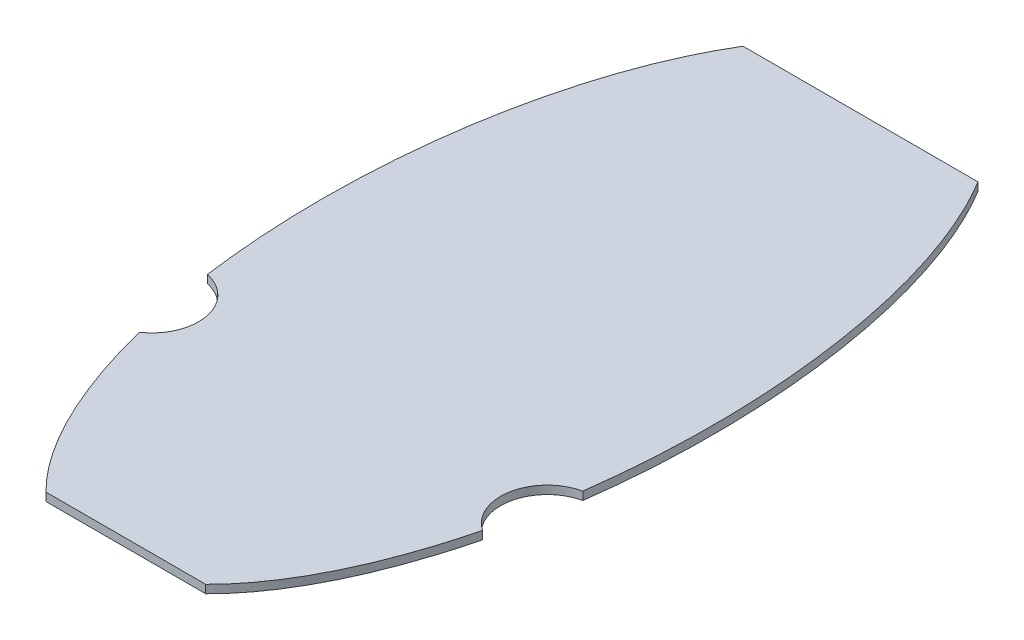
ISO-10303-21;
HEADER;
FILE_DESCRIPTION(('STEP AP214'),'2;1');
FILE_NAME('part.step','',(''),(''),'','','');
FILE_SCHEMA(('AUTOMOTIVE_DESIGN { 1 0 10303 214 1 1 1 1 }'));
ENDSEC;
DATA;
#1=APPLICATION_CONTEXT('core data for automotive mechanical design processes');
#2=APPLICATION_PROTOCOL_DEFINITION('international standard','automotive_design',2000,#1);
#3=PRODUCT_CONTEXT('',#1,'mechanical');
#4=PRODUCT('Part','Part','',(#3));
#5=PRODUCT_RELATED_PRODUCT_CATEGORY('part','',(#4));
#6=PRODUCT_DEFINITION_FORMATION('','',#4);
#7=PRODUCT_DEFINITION_CONTEXT('part definition',#1,'design');
#8=PRODUCT_DEFINITION('design','',#6,#7);
#9=PRODUCT_DEFINITION_SHAPE('','',#8);
#10=(LENGTH_UNIT() NAMED_UNIT(*) SI_UNIT(.MILLI.,.METRE.));
#11=(NAMED_UNIT(*) PLANE_ANGLE_UNIT() SI_UNIT($,.RADIAN.));
#12=(NAMED_UNIT(*) SI_UNIT($,.STERADIAN.) SOLID_ANGLE_UNIT());
#13=UNCERTAINTY_MEASURE_WITH_UNIT(LENGTH_MEASURE(1.E-05),#10,'distance_accuracy_value','');
#14=(GEOMETRIC_REPRESENTATION_CONTEXT(3) GLOBAL_UNCERTAINTY_ASSIGNED_CONTEXT((#13)) GLOBAL_UNIT_ASSIGNED_CONTEXT((#10,
#11,#12)) REPRESENTATION_CONTEXT('',''));
#15=CARTESIAN_POINT('',(0.,0.,0.));
#16=DIRECTION('',(0.,0.,1.));
#17=DIRECTION('',(1.,0.,0.));
#18=AXIS2_PLACEMENT_3D('',#15,#16,#17);
#19=CARTESIAN_POINT('',(0.,0.5588,0.));
#20=DIRECTION('',(0.,1.,0.));
#21=DIRECTION('',(0.,0.,1.));
#22=AXIS2_PLACEMENT_3D('',#19,#20,#21);
#23=PLANE('',#22);
#24=CARTESIAN_POINT('',(0.,0.5588,0.));
#25=DIRECTION('',(0.,1.,0.));
#26=DIRECTION('',(0.,0.,1.));
#27=AXIS2_PLACEMENT_3D('',#24,#25,#26);
#28=ELLIPSE('',#27,29.21,13.335);
#29=CARTESIAN_POINT('',(5.43884297019529,0.5588,26.67));
#30=VERTEX_POINT('',#29);
#31=CARTESIAN_POINT('',(11.687805540383,0.5588,14.0630322860657));
#32=VERTEX_POINT('',#31);
#33=EDGE_CURVE('E139',#30,#32,#28,.T.);
#34=ORIENTED_EDGE('',*,*,#33,.T.);
#35=CARTESIAN_POINT('',(13.462,0.5588,11.43));
#36=DIRECTION('',(0.,1.,0.));
#37=DIRECTION('',(0.,0.,1.));
#38=AXIS2_PLACEMENT_3D('',#35,#36,#37);
#39=CIRCLE('',#38,3.175);
#40=CARTESIAN_POINT('',(12.7814282532744,0.5588,8.32879908784373));
#41=VERTEX_POINT('',#40);
#42=EDGE_CURVE('E98',#41,#32,#39,.T.);
#43=ORIENTED_EDGE('',*,*,#42,.F.);
#44=CARTESIAN_POINT('',(8.00100000000001,0.5588,-23.368));
#45=VERTEX_POINT('',#44);
#46=EDGE_CURVE('E137',#41,#45,#28,.T.);
#47=ORIENTED_EDGE('',*,*,#46,.T.);
#48=DIRECTION('',(-1.,0.,0.));
#49=VECTOR('',#48,1.);
#50=CARTESIAN_POINT('',(-8.00100000000001,0.5588,-23.368));
#51=LINE('',#50,#49);
#52=CARTESIAN_POINT('',(-8.00100000000001,0.5588,-23.368));
#53=VERTEX_POINT('',#52);
#54=EDGE_CURVE('E128',#45,#53,#51,.T.);
#55=ORIENTED_EDGE('',*,*,#54,.T.);
#56=CARTESIAN_POINT('',(0.,0.5588,0.));
#57=DIRECTION('',(0.,1.,0.));
#58=DIRECTION('',(0.,0.,1.));
#59=AXIS2_PLACEMENT_3D('',#56,#57,#58);
#60=ELLIPSE('',#59,29.21,13.335);
#61=CARTESIAN_POINT('',(-12.7814282532744,0.5588,8.32879908784372));
#62=VERTEX_POINT('',#61);
#63=EDGE_CURVE('E146',#53,#62,#60,.T.);
#64=ORIENTED_EDGE('',*,*,#63,.T.);
#65=CARTESIAN_POINT('',(-13.462,0.5588,11.43));
#66=DIRECTION('',(0.,1.,0.));
#67=DIRECTION('',(0.,0.,1.));
#68=AXIS2_PLACEMENT_3D('',#65,#66,#67);
#69=CIRCLE('',#68,3.175);
#70=CARTESIAN_POINT('',(-11.687805540383,0.5588,14.0630322860657));
#71=VERTEX_POINT('',#70);
#72=EDGE_CURVE('E241',#71,#62,#69,.T.);
#73=ORIENTED_EDGE('',*,*,#72,.F.);
#74=CARTESIAN_POINT('',(-5.4388429701953,0.5588,26.67));
#75=VERTEX_POINT('',#74);
#76=EDGE_CURVE('E118',#71,#75,#60,.T.);
#77=ORIENTED_EDGE('',*,*,#76,.T.);
#78=DIRECTION('',(1.,0.,0.));
#79=VECTOR('',#78,1.);
#80=CARTESIAN_POINT('',(-5.4388429701953,0.5588,26.67));
#81=LINE('',#80,#79);
#82=EDGE_CURVE('E144',#75,#30,#81,.T.);
#83=ORIENTED_EDGE('',*,*,#82,.T.);
#84=EDGE_LOOP('',(#34,#43,#47,#55,#64,#73,#77,#83));
#85=FACE_BOUND('',#84,.T.);
#86=ADVANCED_FACE('F33',(#85),#23,.T.);
#87=CARTESIAN_POINT('',(0.,0.,0.));
#88=DIRECTION('',(0.,1.,0.));
#89=DIRECTION('',(0.,0.,1.));
#90=AXIS2_PLACEMENT_3D('',#87,#88,#89);
#91=PLANE('',#90);
#92=CARTESIAN_POINT('',(13.462,0.,11.43));
#93=DIRECTION('',(0.,1.,0.));
#94=DIRECTION('',(0.,0.,1.));
#95=AXIS2_PLACEMENT_3D('',#92,#93,#94);
#96=CIRCLE('',#95,3.175);
#97=CARTESIAN_POINT('',(12.7814282532744,0.,8.32879908784373));
#98=VERTEX_POINT('',#97);
#99=CARTESIAN_POINT('',(11.687805540383,0.,14.0630322860657));
#100=VERTEX_POINT('',#99);
#101=EDGE_CURVE('E48',#98,#100,#96,.T.);
#102=ORIENTED_EDGE('',*,*,#101,.T.);
#103=CARTESIAN_POINT('',(0.,0.,0.));
#104=DIRECTION('',(0.,1.,0.));
#105=DIRECTION('',(0.,0.,1.));
#106=AXIS2_PLACEMENT_3D('',#103,#104,#105);
#107=ELLIPSE('',#106,29.21,13.335);
#108=CARTESIAN_POINT('',(5.43884297019529,0.,26.67));
#109=VERTEX_POINT('',#108);
#110=EDGE_CURVE('E108',#109,#100,#107,.T.);
#111=ORIENTED_EDGE('',*,*,#110,.F.);
#112=DIRECTION('',(1.,0.,0.));
#113=VECTOR('',#112,1.);
#114=CARTESIAN_POINT('',(-5.4388429701953,0.,26.67));
#115=LINE('',#114,#113);
#116=CARTESIAN_POINT('',(-5.4388429701953,0.,26.67));
#117=VERTEX_POINT('',#116);
#118=EDGE_CURVE('E120',#117,#109,#115,.T.);
#119=ORIENTED_EDGE('',*,*,#118,.F.);
#120=CARTESIAN_POINT('',(0.,0.,0.));
#121=DIRECTION('',(0.,1.,0.));
#122=DIRECTION('',(0.,0.,1.));
#123=AXIS2_PLACEMENT_3D('',#120,#121,#122);
#124=ELLIPSE('',#123,29.21,13.335);
#125=CARTESIAN_POINT('',(-11.687805540383,0.,14.0630322860657));
#126=VERTEX_POINT('',#125);
#127=EDGE_CURVE('E233',#126,#117,#124,.T.);
#128=ORIENTED_EDGE('',*,*,#127,.F.);
#129=CARTESIAN_POINT('',(-13.462,0.,11.43));
#130=DIRECTION('',(0.,1.,0.));
#131=DIRECTION('',(0.,0.,1.));
#132=AXIS2_PLACEMENT_3D('',#129,#130,#131);
#133=CIRCLE('',#132,3.175);
#134=CARTESIAN_POINT('',(-12.7814282532744,0.,8.32879908784363));
#135=VERTEX_POINT('',#134);
#136=EDGE_CURVE('E140',#126,#135,#133,.T.);
#137=ORIENTED_EDGE('',*,*,#136,.T.);
#138=CARTESIAN_POINT('',(-8.00100000000001,0.,-23.368));
#139=VERTEX_POINT('',#138);
#140=EDGE_CURVE('E238',#139,#135,#124,.T.);
#141=ORIENTED_EDGE('',*,*,#140,.F.);
#142=DIRECTION('',(-1.,0.,0.));
#143=VECTOR('',#142,1.);
#144=CARTESIAN_POINT('',(-8.00100000000001,0.,-23.368));
#145=LINE('',#144,#143);
#146=CARTESIAN_POINT('',(8.00100000000001,0.,-23.368));
#147=VERTEX_POINT('',#146);
#148=EDGE_CURVE('E116',#147,#139,#145,.T.);
#149=ORIENTED_EDGE('',*,*,#148,.F.);
#150=EDGE_CURVE('E110',#98,#147,#107,.T.);
#151=ORIENTED_EDGE('',*,*,#150,.F.);
#152=EDGE_LOOP('',(#102,#111,#119,#128,#137,#141,#149,#151));
#153=FACE_BOUND('',#152,.T.);
#154=ADVANCED_FACE('F106',(#153),#91,.F.);
#155=DIRECTION('',(0.,-1.,0.));
#156=VECTOR('',#155,1.);
#157=SURFACE_OF_LINEAR_EXTRUSION('',#28,#156);
#158=DIRECTION('',(0.,-1.,0.));
#159=VECTOR('',#158,1.);
#160=CARTESIAN_POINT('',(11.687805540383,0.5588,14.0630322860657));
#161=LINE('',#160,#159);
#162=EDGE_CURVE('E11',#32,#100,#161,.T.);
#163=ORIENTED_EDGE('',*,*,#162,.F.);
#164=ORIENTED_EDGE('',*,*,#33,.F.);
#165=DIRECTION('',(0.,-1.,0.));
#166=VECTOR('',#165,1.);
#167=CARTESIAN_POINT('',(5.43884297019529,0.5588,26.67));
#168=LINE('',#167,#166);
#169=EDGE_CURVE('E115',#30,#109,#168,.T.);
#170=ORIENTED_EDGE('',*,*,#169,.T.);
#171=ORIENTED_EDGE('',*,*,#110,.T.);
#172=EDGE_LOOP('',(#163,#164,#170,#171));
#173=FACE_BOUND('',#172,.T.);
#174=ADVANCED_FACE('F113',(#173),#157,.F.);
#175=DIRECTION('',(0.,-1.,0.));
#176=VECTOR('',#175,1.);
#177=CARTESIAN_POINT('',(12.7814282532744,0.5588,8.32879908784373));
#178=LINE('',#177,#176);
#179=EDGE_CURVE('E42',#98,#41,#178,.F.);
#180=ORIENTED_EDGE('',*,*,#179,.F.);
#181=ORIENTED_EDGE('',*,*,#150,.T.);
#182=DIRECTION('',(0.,-1.,0.));
#183=VECTOR('',#182,1.);
#184=CARTESIAN_POINT('',(8.00100000000001,0.5588,-23.368));
#185=LINE('',#184,#183);
#186=EDGE_CURVE('E127',#45,#147,#185,.T.);
#187=ORIENTED_EDGE('',*,*,#186,.F.);
#188=ORIENTED_EDGE('',*,*,#46,.F.);
#189=EDGE_LOOP('',(#180,#181,#187,#188));
#190=FACE_BOUND('',#189,.T.);
#191=ADVANCED_FACE('F142',(#190),#157,.F.);
#192=DIRECTION('',(0.,-1.,0.));
#193=VECTOR('',#192,1.);
#194=SURFACE_OF_LINEAR_EXTRUSION('',#60,#193);
#195=DIRECTION('',(0.,-1.,0.));
#196=VECTOR('',#195,1.);
#197=CARTESIAN_POINT('',(-11.687805540383,0.5588,14.0630322860658));
#198=LINE('',#197,#196);
#199=EDGE_CURVE('E230',#126,#71,#198,.F.);
#200=ORIENTED_EDGE('',*,*,#199,.F.);
#201=ORIENTED_EDGE('',*,*,#127,.T.);
#202=DIRECTION('',(0.,-1.,0.));
#203=VECTOR('',#202,1.);
#204=CARTESIAN_POINT('',(-5.4388429701953,0.5588,26.67));
#205=LINE('',#204,#203);
#206=EDGE_CURVE('E132',#75,#117,#205,.T.);
#207=ORIENTED_EDGE('',*,*,#206,.F.);
#208=ORIENTED_EDGE('',*,*,#76,.F.);
#209=EDGE_LOOP('',(#200,#201,#207,#208));
#210=FACE_BOUND('',#209,.T.);
#211=ADVANCED_FACE('F35',(#210),#194,.F.);
#212=DIRECTION('',(0.,-1.,0.));
#213=VECTOR('',#212,1.);
#214=CARTESIAN_POINT('',(-12.7814282532744,0.5588,8.32879908784361));
#215=LINE('',#214,#213);
#216=EDGE_CURVE('E56',#62,#135,#215,.T.);
#217=ORIENTED_EDGE('',*,*,#216,.F.);
#218=ORIENTED_EDGE('',*,*,#63,.F.);
#219=DIRECTION('',(0.,-1.,0.));
#220=VECTOR('',#219,1.);
#221=CARTESIAN_POINT('',(-8.00100000000001,0.5588,-23.368));
#222=LINE('',#221,#220);
#223=EDGE_CURVE('E124',#53,#139,#222,.T.);
#224=ORIENTED_EDGE('',*,*,#223,.T.);
#225=ORIENTED_EDGE('',*,*,#140,.T.);
#226=EDGE_LOOP('',(#217,#218,#224,#225));
#227=FACE_BOUND('',#226,.T.);
#228=ADVANCED_FACE('F157',(#227),#194,.F.);
#229=CARTESIAN_POINT('',(-5.4388429701953,0.5588,26.67));
#230=DIRECTION('',(0.,0.,-1.));
#231=DIRECTION('',(-1.,0.,0.));
#232=AXIS2_PLACEMENT_3D('',#229,#230,#231);
#233=PLANE('',#232);
#234=ORIENTED_EDGE('',*,*,#118,.T.);
#235=ORIENTED_EDGE('',*,*,#169,.F.);
#236=ORIENTED_EDGE('',*,*,#82,.F.);
#237=ORIENTED_EDGE('',*,*,#206,.T.);
#238=EDGE_LOOP('',(#234,#235,#236,#237));
#239=FACE_BOUND('',#238,.T.);
#240=ADVANCED_FACE('F155',(#239),#233,.F.);
#241=CARTESIAN_POINT('',(-8.00100000000001,0.5588,-23.368));
#242=DIRECTION('',(0.,0.,1.));
#243=DIRECTION('',(1.,0.,0.));
#244=AXIS2_PLACEMENT_3D('',#241,#242,#243);
#245=PLANE('',#244);
#246=ORIENTED_EDGE('',*,*,#148,.T.);
#247=ORIENTED_EDGE('',*,*,#223,.F.);
#248=ORIENTED_EDGE('',*,*,#54,.F.);
#249=ORIENTED_EDGE('',*,*,#186,.T.);
#250=EDGE_LOOP('',(#246,#247,#248,#249));
#251=FACE_BOUND('',#250,.T.);
#252=ADVANCED_FACE('F153',(#251),#245,.F.);
#253=CARTESIAN_POINT('',(-13.462,0.5588,11.43));
#254=DIRECTION('',(0.,-1.,0.));
#255=DIRECTION('',(0.,0.,-1.));
#256=AXIS2_PLACEMENT_3D('',#253,#254,#255);
#257=CYLINDRICAL_SURFACE('',#256,3.175);
#258=ORIENTED_EDGE('',*,*,#199,.T.);
#259=ORIENTED_EDGE('',*,*,#72,.T.);
#260=ORIENTED_EDGE('',*,*,#216,.T.);
#261=ORIENTED_EDGE('',*,*,#136,.F.);
#262=EDGE_LOOP('',(#258,#259,#260,#261));
#263=FACE_BOUND('',#262,.T.);
#264=ADVANCED_FACE('F163',(#263),#257,.F.);
#265=CARTESIAN_POINT('',(13.462,0.5588,11.43));
#266=DIRECTION('',(0.,-1.,0.));
#267=DIRECTION('',(0.,0.,-1.));
#268=AXIS2_PLACEMENT_3D('',#265,#266,#267);
#269=CYLINDRICAL_SURFACE('',#268,3.175);
#270=ORIENTED_EDGE('',*,*,#162,.T.);
#271=ORIENTED_EDGE('',*,*,#101,.F.);
#272=ORIENTED_EDGE('',*,*,#179,.T.);
#273=ORIENTED_EDGE('',*,*,#42,.T.);
#274=EDGE_LOOP('',(#270,#271,#272,#273));
#275=FACE_BOUND('',#274,.T.);
#276=ADVANCED_FACE('F96',(#275),#269,.F.);
#277=CLOSED_SHELL('',(#86,#154,#174,#191,#211,#228,#240,#252,#264,#276));
#278=MANIFOLD_SOLID_BREP('B2',#277);
#279=ADVANCED_BREP_SHAPE_REPRESENTATION('',(#18,#278),#14);
#280=SHAPE_DEFINITION_REPRESENTATION(#9,#279);
ENDSEC;
END-ISO-10303-21;
